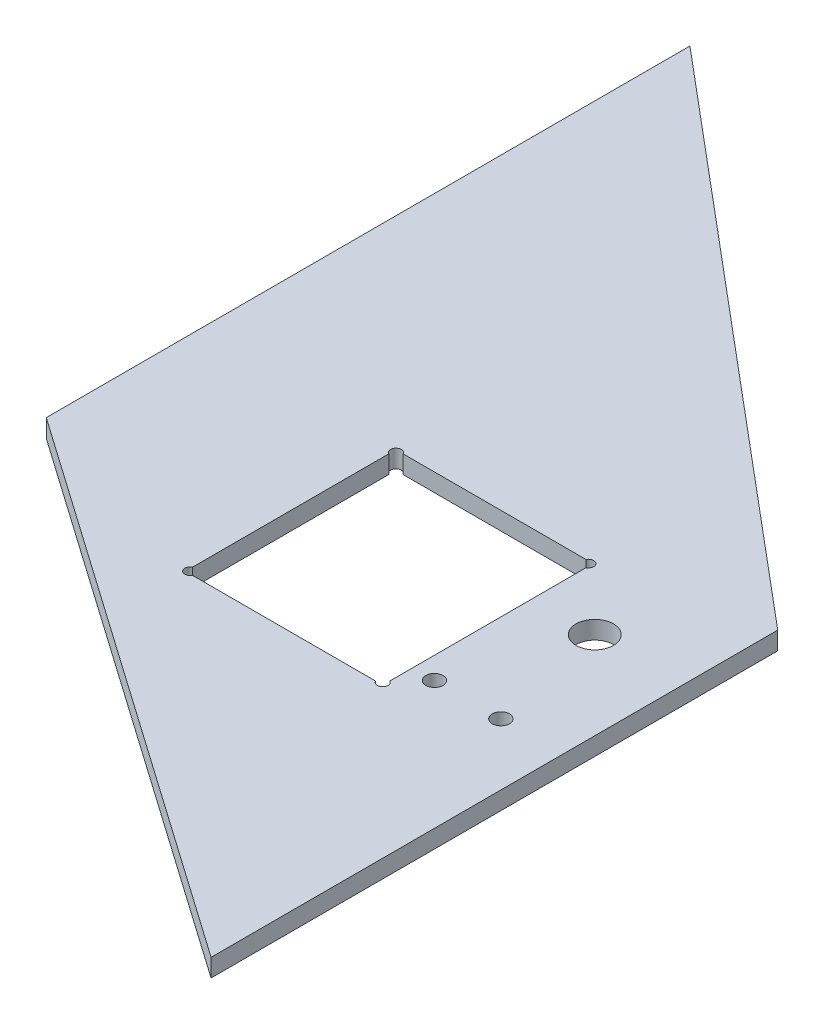
ISO-10303-21;
HEADER;
FILE_DESCRIPTION(('STEP AP214'),'2;1');
FILE_NAME('part.step','',(''),(''),'','','');
FILE_SCHEMA(('AUTOMOTIVE_DESIGN { 1 0 10303 214 1 1 1 1 }'));
ENDSEC;
DATA;
#1=APPLICATION_CONTEXT('core data for automotive mechanical design processes');
#2=APPLICATION_PROTOCOL_DEFINITION('international standard','automotive_design',2000,#1);
#3=PRODUCT_CONTEXT('',#1,'mechanical');
#4=PRODUCT('Part','Part','',(#3));
#5=PRODUCT_RELATED_PRODUCT_CATEGORY('part','',(#4));
#6=PRODUCT_DEFINITION_FORMATION('','',#4);
#7=PRODUCT_DEFINITION_CONTEXT('part definition',#1,'design');
#8=PRODUCT_DEFINITION('design','',#6,#7);
#9=PRODUCT_DEFINITION_SHAPE('','',#8);
#10=(LENGTH_UNIT() NAMED_UNIT(*) SI_UNIT(.MILLI.,.METRE.));
#11=(NAMED_UNIT(*) PLANE_ANGLE_UNIT() SI_UNIT($,.RADIAN.));
#12=(NAMED_UNIT(*) SI_UNIT($,.STERADIAN.) SOLID_ANGLE_UNIT());
#13=UNCERTAINTY_MEASURE_WITH_UNIT(LENGTH_MEASURE(1.E-05),#10,'distance_accuracy_value','');
#14=(GEOMETRIC_REPRESENTATION_CONTEXT(3) GLOBAL_UNCERTAINTY_ASSIGNED_CONTEXT((#13)) GLOBAL_UNIT_ASSIGNED_CONTEXT((#10,
#11,#12)) REPRESENTATION_CONTEXT('',''));
#15=CARTESIAN_POINT('',(0.,0.,0.));
#16=DIRECTION('',(0.,0.,1.));
#17=DIRECTION('',(1.,0.,0.));
#18=AXIS2_PLACEMENT_3D('',#15,#16,#17);
#19=CARTESIAN_POINT('',(0.,-1.27,-9.93045313249222));
#20=DIRECTION('',(0.643306704952837,0.,-0.765608570591215));
#21=DIRECTION('',(0.765608570591215,0.,0.643306704952837));
#22=AXIS2_PLACEMENT_3D('',#19,#20,#21);
#23=PLANE('',#22);
#24=DIRECTION('',(0.,1.,0.));
#25=VECTOR('',#24,1.);
#26=CARTESIAN_POINT('',(116.619290139619,-1.27,88.059530464118));
#27=LINE('',#26,#25);
#28=CARTESIAN_POINT('',(116.619290139619,-1.27,88.059530464118));
#29=VERTEX_POINT('',#28);
#30=CARTESIAN_POINT('',(116.619290139619,2.54,88.059530464118));
#31=VERTEX_POINT('',#30);
#32=EDGE_CURVE('E223',#29,#31,#27,.T.);
#33=ORIENTED_EDGE('',*,*,#32,.F.);
#34=DIRECTION('',(0.765608570591215,0.,0.643306704952837));
#35=VECTOR('',#34,1.);
#36=CARTESIAN_POINT('',(0.,-1.27,-9.93045313249222));
#37=LINE('',#36,#35);
#38=CARTESIAN_POINT('',(0.,-1.27,-9.93045313249222));
#39=VERTEX_POINT('',#38);
#40=EDGE_CURVE('E214',#39,#29,#37,.T.);
#41=ORIENTED_EDGE('',*,*,#40,.F.);
#42=DIRECTION('',(0.,1.,0.));
#43=VECTOR('',#42,1.);
#44=CARTESIAN_POINT('',(0.,-1.27,-9.93045313249222));
#45=LINE('',#44,#43);
#46=CARTESIAN_POINT('',(0.,2.54,-9.93045313249222));
#47=VERTEX_POINT('',#46);
#48=EDGE_CURVE('E224',#39,#47,#45,.T.);
#49=ORIENTED_EDGE('',*,*,#48,.T.);
#50=DIRECTION('',(0.765608570591215,0.,0.643306704952837));
#51=VECTOR('',#50,1.);
#52=CARTESIAN_POINT('',(0.,2.54,-9.93045313249222));
#53=LINE('',#52,#51);
#54=EDGE_CURVE('E195',#47,#31,#53,.T.);
#55=ORIENTED_EDGE('',*,*,#54,.T.);
#56=EDGE_LOOP('',(#33,#41,#49,#55));
#57=FACE_BOUND('',#56,.T.);
#58=ADVANCED_FACE('F37',(#57),#23,.T.);
#59=CARTESIAN_POINT('',(0.,-1.27,-9.93045313249222));
#60=DIRECTION('',(-1.,0.,0.));
#61=DIRECTION('',(0.,0.,-1.));
#62=AXIS2_PLACEMENT_3D('',#59,#60,#61);
#63=PLANE('',#62);
#64=ORIENTED_EDGE('',*,*,#48,.F.);
#65=DIRECTION('',(0.,0.,-1.));
#66=VECTOR('',#65,1.);
#67=CARTESIAN_POINT('',(0.,-1.27,-9.93045313249222));
#68=LINE('',#67,#66);
#69=CARTESIAN_POINT('',(0.,-1.27,126.604027306006));
#70=VERTEX_POINT('',#69);
#71=EDGE_CURVE('E221',#70,#39,#68,.T.);
#72=ORIENTED_EDGE('',*,*,#71,.F.);
#73=DIRECTION('',(0.,1.,0.));
#74=VECTOR('',#73,1.);
#75=CARTESIAN_POINT('',(0.,-1.27,126.604027306006));
#76=LINE('',#75,#74);
#77=CARTESIAN_POINT('',(0.,2.54,126.604027306006));
#78=VERTEX_POINT('',#77);
#79=EDGE_CURVE('E228',#70,#78,#76,.T.);
#80=ORIENTED_EDGE('',*,*,#79,.T.);
#81=DIRECTION('',(0.,0.,-1.));
#82=VECTOR('',#81,1.);
#83=CARTESIAN_POINT('',(0.,2.54,-9.93045313249222));
#84=LINE('',#83,#82);
#85=EDGE_CURVE('E202',#78,#47,#84,.T.);
#86=ORIENTED_EDGE('',*,*,#85,.T.);
#87=EDGE_LOOP('',(#64,#72,#80,#86));
#88=FACE_BOUND('',#87,.T.);
#89=ADVANCED_FACE('F268',(#88),#63,.T.);
#90=CARTESIAN_POINT('',(0.,-1.27,126.604027306006));
#91=DIRECTION('',(-0.573576436351047,0.,0.819152044288991));
#92=DIRECTION('',(-0.819152044288991,0.,-0.573576436351047));
#93=AXIS2_PLACEMENT_3D('',#90,#91,#92);
#94=PLANE('',#93);
#95=ORIENTED_EDGE('',*,*,#79,.F.);
#96=DIRECTION('',(-0.819152044288991,0.,-0.573576436351047));
#97=VECTOR('',#96,1.);
#98=CARTESIAN_POINT('',(0.,-1.27,126.604027306006));
#99=LINE('',#98,#97);
#100=CARTESIAN_POINT('',(116.619290139619,-1.27,208.261733362433));
#101=VERTEX_POINT('',#100);
#102=EDGE_CURVE('E219',#101,#70,#99,.T.);
#103=ORIENTED_EDGE('',*,*,#102,.F.);
#104=DIRECTION('',(0.,1.,0.));
#105=VECTOR('',#104,1.);
#106=CARTESIAN_POINT('',(116.619290139619,-1.27,208.261733362433));
#107=LINE('',#106,#105);
#108=CARTESIAN_POINT('',(116.619290139619,2.54,208.261733362433));
#109=VERTEX_POINT('',#108);
#110=EDGE_CURVE('E231',#101,#109,#107,.T.);
#111=ORIENTED_EDGE('',*,*,#110,.T.);
#112=DIRECTION('',(-0.819152044288991,0.,-0.573576436351047));
#113=VECTOR('',#112,1.);
#114=CARTESIAN_POINT('',(0.,2.54,126.604027306006));
#115=LINE('',#114,#113);
#116=EDGE_CURVE('E200',#109,#78,#115,.T.);
#117=ORIENTED_EDGE('',*,*,#116,.T.);
#118=EDGE_LOOP('',(#95,#103,#111,#117));
#119=FACE_BOUND('',#118,.T.);
#120=ADVANCED_FACE('F273',(#119),#94,.T.);
#121=CARTESIAN_POINT('',(116.619290139619,-1.27,208.261733362433));
#122=DIRECTION('',(1.,0.,0.));
#123=DIRECTION('',(0.,0.,1.));
#124=AXIS2_PLACEMENT_3D('',#121,#122,#123);
#125=PLANE('',#124);
#126=ORIENTED_EDGE('',*,*,#110,.F.);
#127=DIRECTION('',(0.,0.,1.));
#128=VECTOR('',#127,1.);
#129=CARTESIAN_POINT('',(116.619290139619,-1.27,208.261733362433));
#130=LINE('',#129,#128);
#131=EDGE_CURVE('E217',#29,#101,#130,.T.);
#132=ORIENTED_EDGE('',*,*,#131,.F.);
#133=ORIENTED_EDGE('',*,*,#32,.T.);
#134=DIRECTION('',(0.,0.,1.));
#135=VECTOR('',#134,1.);
#136=CARTESIAN_POINT('',(116.619290139619,2.54,208.261733362433));
#137=LINE('',#136,#135);
#138=EDGE_CURVE('E198',#31,#109,#137,.T.);
#139=ORIENTED_EDGE('',*,*,#138,.T.);
#140=EDGE_LOOP('',(#126,#132,#133,#139));
#141=FACE_BOUND('',#140,.T.);
#142=ADVANCED_FACE('F281',(#141),#125,.T.);
#143=CARTESIAN_POINT('',(116.619290139619,-1.27,88.059530464118));
#144=DIRECTION('',(0.,-1.,0.));
#145=DIRECTION('',(0.,0.,1.));
#146=AXIS2_PLACEMENT_3D('',#143,#144,#145);
#147=PLANE('',#146);
#148=CARTESIAN_POINT('',(84.3172932249785,-1.27,95.9237113979477));
#149=DIRECTION('',(0.,-1.,0.));
#150=DIRECTION('',(0.,0.,-1.));
#151=AXIS2_PLACEMENT_3D('',#148,#149,#150);
#152=CIRCLE('',#151,1.1303);
#153=CARTESIAN_POINT('',(83.3075833210953,-1.27,95.4157113979477));
#154=VERTEX_POINT('',#153);
#155=CARTESIAN_POINT('',(84.8252932249785,-1.27,96.933421301831));
#156=VERTEX_POINT('',#155);
#157=EDGE_CURVE('E133',#154,#156,#152,.T.);
#158=ORIENTED_EDGE('',*,*,#157,.F.);
#159=DIRECTION('',(1.,0.,0.));
#160=VECTOR('',#159,1.);
#161=CARTESIAN_POINT('',(42.9822463420664,-1.27,95.4157113979477));
#162=LINE('',#161,#160);
#163=CARTESIAN_POINT('',(44.4999562459497,-1.27,95.4157113979477));
#164=VERTEX_POINT('',#163);
#165=EDGE_CURVE('E178',#164,#154,#162,.T.);
#166=ORIENTED_EDGE('',*,*,#165,.F.);
#167=CARTESIAN_POINT('',(43.4902463420664,-1.27,95.9237113979477));
#168=DIRECTION('',(0.,-1.,0.));
#169=DIRECTION('',(0.,0.,-1.));
#170=AXIS2_PLACEMENT_3D('',#167,#168,#169);
#171=CIRCLE('',#170,1.13029999999999);
#172=CARTESIAN_POINT('',(42.9822463420664,-1.27,96.933421301831));
#173=VERTEX_POINT('',#172);
#174=EDGE_CURVE('E158',#173,#164,#171,.T.);
#175=ORIENTED_EDGE('',*,*,#174,.F.);
#176=DIRECTION('',(0.,0.,-1.));
#177=VECTOR('',#176,1.);
#178=CARTESIAN_POINT('',(42.9822463420664,-1.27,138.798911397948));
#179=LINE('',#178,#177);
#180=CARTESIAN_POINT('',(42.9822463420664,-1.27,138.551201494064));
#181=VERTEX_POINT('',#180);
#182=EDGE_CURVE('E142',#181,#173,#179,.T.);
#183=ORIENTED_EDGE('',*,*,#182,.F.);
#184=CARTESIAN_POINT('',(43.4902463420664,-1.27,139.560911397948));
#185=DIRECTION('',(0.,-1.,0.));
#186=DIRECTION('',(0.,0.,-1.));
#187=AXIS2_PLACEMENT_3D('',#184,#185,#186);
#188=CIRCLE('',#187,1.13029999999999);
#189=CARTESIAN_POINT('',(44.4999562459497,-1.27,140.068911397948));
#190=VERTEX_POINT('',#189);
#191=EDGE_CURVE('E165',#190,#181,#188,.T.);
#192=ORIENTED_EDGE('',*,*,#191,.F.);
#193=DIRECTION('',(-1.,0.,0.));
#194=VECTOR('',#193,1.);
#195=CARTESIAN_POINT('',(42.9822463420664,-1.27,140.068911397948));
#196=LINE('',#195,#194);
#197=CARTESIAN_POINT('',(83.3075833210953,-1.27,140.068911397948));
#198=VERTEX_POINT('',#197);
#199=EDGE_CURVE('E172',#198,#190,#196,.T.);
#200=ORIENTED_EDGE('',*,*,#199,.F.);
#201=CARTESIAN_POINT('',(84.3172932249785,-1.27,139.560911397948));
#202=DIRECTION('',(0.,-1.,0.));
#203=DIRECTION('',(0.,0.,-1.));
#204=AXIS2_PLACEMENT_3D('',#201,#202,#203);
#205=CIRCLE('',#204,1.1303);
#206=CARTESIAN_POINT('',(84.8252932249785,-1.27,138.551201494064));
#207=VERTEX_POINT('',#206);
#208=EDGE_CURVE('E141',#207,#198,#205,.T.);
#209=ORIENTED_EDGE('',*,*,#208,.F.);
#210=DIRECTION('',(0.,0.,1.));
#211=VECTOR('',#210,1.);
#212=CARTESIAN_POINT('',(84.8252932249785,-1.27,138.798911397948));
#213=LINE('',#212,#211);
#214=EDGE_CURVE('E128',#156,#207,#213,.T.);
#215=ORIENTED_EDGE('',*,*,#214,.F.);
#216=EDGE_LOOP('',(#158,#166,#175,#183,#192,#200,#209,#215));
#217=FACE_BOUND('',#216,.T.);
#218=CARTESIAN_POINT('',(103.545290714358,-1.27,133.71692050092));
#219=DIRECTION('',(0.,-1.,0.));
#220=DIRECTION('',(0.,0.,-1.));
#221=AXIS2_PLACEMENT_3D('',#218,#219,#220);
#222=CIRCLE('',#221,1.8288);
#223=CARTESIAN_POINT('',(103.545290714358,-1.27,131.88812050092));
#224=VERTEX_POINT('',#223);
#225=EDGE_CURVE('E204',#224,#224,#222,.T.);
#226=ORIENTED_EDGE('',*,*,#225,.F.);
#227=EDGE_LOOP('',(#226));
#228=FACE_BOUND('',#227,.T.);
#229=CARTESIAN_POINT('',(89.4586071669914,-1.27,133.71692050092));
#230=DIRECTION('',(0.,-1.,0.));
#231=DIRECTION('',(0.,0.,-1.));
#232=AXIS2_PLACEMENT_3D('',#229,#230,#231);
#233=CIRCLE('',#232,1.82880000000002);
#234=CARTESIAN_POINT('',(89.4586071669914,-1.27,131.88812050092));
#235=VERTEX_POINT('',#234);
#236=EDGE_CURVE('E143',#235,#235,#233,.T.);
#237=ORIENTED_EDGE('',*,*,#236,.F.);
#238=EDGE_LOOP('',(#237));
#239=FACE_BOUND('',#238,.T.);
#240=CARTESIAN_POINT('',(98.0423838871812,-1.27,108.29992028092));
#241=DIRECTION('',(0.,-1.,0.));
#242=DIRECTION('',(0.,0.,-1.));
#243=AXIS2_PLACEMENT_3D('',#240,#241,#242);
#244=CIRCLE('',#243,3.96874999999998);
#245=CARTESIAN_POINT('',(98.0423838871812,-1.27,104.33117028092));
#246=VERTEX_POINT('',#245);
#247=EDGE_CURVE('E211',#246,#246,#244,.T.);
#248=ORIENTED_EDGE('',*,*,#247,.F.);
#249=EDGE_LOOP('',(#248));
#250=FACE_BOUND('',#249,.T.);
#251=ORIENTED_EDGE('',*,*,#40,.T.);
#252=ORIENTED_EDGE('',*,*,#131,.T.);
#253=ORIENTED_EDGE('',*,*,#102,.T.);
#254=ORIENTED_EDGE('',*,*,#71,.T.);
#255=EDGE_LOOP('',(#251,#252,#253,#254));
#256=FACE_BOUND('',#255,.T.);
#257=ADVANCED_FACE('F137',(#217,#228,#239,#250,#256),#147,.T.);
#258=CARTESIAN_POINT('',(98.0423838871812,-1.27,108.29992028092));
#259=DIRECTION('',(0.,1.,0.));
#260=DIRECTION('',(0.,0.,-1.));
#261=AXIS2_PLACEMENT_3D('',#258,#259,#260);
#262=CYLINDRICAL_SURFACE('',#261,3.96874999999998);
#263=ORIENTED_EDGE('',*,*,#247,.T.);
#264=EDGE_LOOP('',(#263));
#265=FACE_BOUND('',#264,.T.);
#266=CARTESIAN_POINT('',(98.0423838871812,2.54,108.29992028092));
#267=DIRECTION('',(0.,-1.,0.));
#268=DIRECTION('',(0.,0.,-1.));
#269=AXIS2_PLACEMENT_3D('',#266,#267,#268);
#270=CIRCLE('',#269,3.96874999999998);
#271=CARTESIAN_POINT('',(98.0423838871812,2.54,104.33117028092));
#272=VERTEX_POINT('',#271);
#273=EDGE_CURVE('E192',#272,#272,#270,.T.);
#274=ORIENTED_EDGE('',*,*,#273,.F.);
#275=EDGE_LOOP('',(#274));
#276=FACE_BOUND('',#275,.T.);
#277=ADVANCED_FACE('F299',(#265,#276),#262,.F.);
#278=CARTESIAN_POINT('',(84.8252932249785,-1.27,138.798911397948));
#279=DIRECTION('',(1.,0.,0.));
#280=DIRECTION('',(0.,0.,1.));
#281=AXIS2_PLACEMENT_3D('',#278,#279,#280);
#282=PLANE('',#281);
#283=ORIENTED_EDGE('',*,*,#214,.T.);
#284=DIRECTION('',(0.,1.,0.));
#285=VECTOR('',#284,1.);
#286=CARTESIAN_POINT('',(84.8252932249785,2.54,138.551201494064));
#287=LINE('',#286,#285);
#288=CARTESIAN_POINT('',(84.8252932249785,2.54,138.551201494064));
#289=VERTEX_POINT('',#288);
#290=EDGE_CURVE('E153',#289,#207,#287,.F.);
#291=ORIENTED_EDGE('',*,*,#290,.F.);
#292=DIRECTION('',(0.,0.,1.));
#293=VECTOR('',#292,1.);
#294=CARTESIAN_POINT('',(84.8252932249785,2.54,138.798911397948));
#295=LINE('',#294,#293);
#296=CARTESIAN_POINT('',(84.8252932249785,2.54,96.933421301831));
#297=VERTEX_POINT('',#296);
#298=EDGE_CURVE('E131',#297,#289,#295,.T.);
#299=ORIENTED_EDGE('',*,*,#298,.F.);
#300=DIRECTION('',(0.,1.,0.));
#301=VECTOR('',#300,1.);
#302=CARTESIAN_POINT('',(84.8252932249785,2.54,96.933421301831));
#303=LINE('',#302,#301);
#304=EDGE_CURVE('E124',#156,#297,#303,.T.);
#305=ORIENTED_EDGE('',*,*,#304,.F.);
#306=EDGE_LOOP('',(#283,#291,#299,#305));
#307=FACE_BOUND('',#306,.T.);
#308=ADVANCED_FACE('F126',(#307),#282,.F.);
#309=CARTESIAN_POINT('',(42.9822463420664,-1.27,138.798911397948));
#310=DIRECTION('',(-1.,0.,0.));
#311=DIRECTION('',(0.,0.,-1.));
#312=AXIS2_PLACEMENT_3D('',#309,#310,#311);
#313=PLANE('',#312);
#314=DIRECTION('',(0.,0.,-1.));
#315=VECTOR('',#314,1.);
#316=CARTESIAN_POINT('',(42.9822463420664,2.54,138.798911397948));
#317=LINE('',#316,#315);
#318=CARTESIAN_POINT('',(42.9822463420664,2.54,138.551201494064));
#319=VERTEX_POINT('',#318);
#320=CARTESIAN_POINT('',(42.9822463420664,2.54,96.933421301831));
#321=VERTEX_POINT('',#320);
#322=EDGE_CURVE('E189',#319,#321,#317,.T.);
#323=ORIENTED_EDGE('',*,*,#322,.F.);
#324=DIRECTION('',(0.,1.,0.));
#325=VECTOR('',#324,1.);
#326=CARTESIAN_POINT('',(42.9822463420664,2.54,138.551201494064));
#327=LINE('',#326,#325);
#328=EDGE_CURVE('E168',#181,#319,#327,.T.);
#329=ORIENTED_EDGE('',*,*,#328,.F.);
#330=ORIENTED_EDGE('',*,*,#182,.T.);
#331=DIRECTION('',(0.,1.,0.));
#332=VECTOR('',#331,1.);
#333=CARTESIAN_POINT('',(42.9822463420664,2.54,96.933421301831));
#334=LINE('',#333,#332);
#335=EDGE_CURVE('E161',#321,#173,#334,.F.);
#336=ORIENTED_EDGE('',*,*,#335,.F.);
#337=EDGE_LOOP('',(#323,#329,#330,#336));
#338=FACE_BOUND('',#337,.T.);
#339=ADVANCED_FACE('F251',(#338),#313,.F.);
#340=CARTESIAN_POINT('',(89.4586071669914,-1.27,133.71692050092));
#341=DIRECTION('',(0.,1.,0.));
#342=DIRECTION('',(0.,0.,-1.));
#343=AXIS2_PLACEMENT_3D('',#340,#341,#342);
#344=CYLINDRICAL_SURFACE('',#343,1.82880000000002);
#345=ORIENTED_EDGE('',*,*,#236,.T.);
#346=EDGE_LOOP('',(#345));
#347=FACE_BOUND('',#346,.T.);
#348=CARTESIAN_POINT('',(89.4586071669914,2.54,133.71692050092));
#349=DIRECTION('',(0.,-1.,0.));
#350=DIRECTION('',(0.,0.,-1.));
#351=AXIS2_PLACEMENT_3D('',#348,#349,#350);
#352=CIRCLE('',#351,1.82880000000002);
#353=CARTESIAN_POINT('',(89.4586071669914,2.54,131.88812050092));
#354=VERTEX_POINT('',#353);
#355=EDGE_CURVE('E185',#354,#354,#352,.T.);
#356=ORIENTED_EDGE('',*,*,#355,.F.);
#357=EDGE_LOOP('',(#356));
#358=FACE_BOUND('',#357,.T.);
#359=ADVANCED_FACE('F307',(#347,#358),#344,.F.);
#360=CARTESIAN_POINT('',(103.545290714358,-1.27,133.71692050092));
#361=DIRECTION('',(0.,1.,0.));
#362=DIRECTION('',(0.,0.,-1.));
#363=AXIS2_PLACEMENT_3D('',#360,#361,#362);
#364=CYLINDRICAL_SURFACE('',#363,1.8288);
#365=ORIENTED_EDGE('',*,*,#225,.T.);
#366=EDGE_LOOP('',(#365));
#367=FACE_BOUND('',#366,.T.);
#368=CARTESIAN_POINT('',(103.545290714358,2.54,133.71692050092));
#369=DIRECTION('',(0.,-1.,0.));
#370=DIRECTION('',(0.,0.,-1.));
#371=AXIS2_PLACEMENT_3D('',#368,#369,#370);
#372=CIRCLE('',#371,1.8288);
#373=CARTESIAN_POINT('',(103.545290714358,2.54,131.88812050092));
#374=VERTEX_POINT('',#373);
#375=EDGE_CURVE('E180',#374,#374,#372,.T.);
#376=ORIENTED_EDGE('',*,*,#375,.F.);
#377=EDGE_LOOP('',(#376));
#378=FACE_BOUND('',#377,.T.);
#379=ADVANCED_FACE('F310',(#367,#378),#364,.F.);
#380=CARTESIAN_POINT('',(116.619290139619,2.54,88.059530464118));
#381=DIRECTION('',(0.,-1.,0.));
#382=DIRECTION('',(0.,0.,1.));
#383=AXIS2_PLACEMENT_3D('',#380,#381,#382);
#384=PLANE('',#383);
#385=ORIENTED_EDGE('',*,*,#355,.T.);
#386=EDGE_LOOP('',(#385));
#387=FACE_BOUND('',#386,.T.);
#388=ORIENTED_EDGE('',*,*,#273,.T.);
#389=EDGE_LOOP('',(#388));
#390=FACE_BOUND('',#389,.T.);
#391=ORIENTED_EDGE('',*,*,#54,.F.);
#392=ORIENTED_EDGE('',*,*,#85,.F.);
#393=ORIENTED_EDGE('',*,*,#116,.F.);
#394=ORIENTED_EDGE('',*,*,#138,.F.);
#395=EDGE_LOOP('',(#391,#392,#393,#394));
#396=FACE_BOUND('',#395,.T.);
#397=ORIENTED_EDGE('',*,*,#298,.T.);
#398=CARTESIAN_POINT('',(84.3172932249785,2.54,139.560911397948));
#399=DIRECTION('',(0.,-1.,0.));
#400=DIRECTION('',(0.,0.,-1.));
#401=AXIS2_PLACEMENT_3D('',#398,#399,#400);
#402=CIRCLE('',#401,1.13029999999999);
#403=CARTESIAN_POINT('',(83.3075833210953,2.54,140.068911397948));
#404=VERTEX_POINT('',#403);
#405=EDGE_CURVE('E132',#289,#404,#402,.T.);
#406=ORIENTED_EDGE('',*,*,#405,.T.);
#407=DIRECTION('',(-1.,0.,0.));
#408=VECTOR('',#407,1.);
#409=CARTESIAN_POINT('',(42.9822463420664,2.54,140.068911397948));
#410=LINE('',#409,#408);
#411=CARTESIAN_POINT('',(44.4999562459497,2.54,140.068911397948));
#412=VERTEX_POINT('',#411);
#413=EDGE_CURVE('E171',#404,#412,#410,.T.);
#414=ORIENTED_EDGE('',*,*,#413,.T.);
#415=CARTESIAN_POINT('',(43.4902463420664,2.54,139.560911397948));
#416=DIRECTION('',(0.,-1.,0.));
#417=DIRECTION('',(0.,0.,-1.));
#418=AXIS2_PLACEMENT_3D('',#415,#416,#417);
#419=CIRCLE('',#418,1.13029999999999);
#420=EDGE_CURVE('E163',#412,#319,#419,.T.);
#421=ORIENTED_EDGE('',*,*,#420,.T.);
#422=ORIENTED_EDGE('',*,*,#322,.T.);
#423=CARTESIAN_POINT('',(43.4902463420664,2.54,95.9237113979477));
#424=DIRECTION('',(0.,-1.,0.));
#425=DIRECTION('',(0.,0.,-1.));
#426=AXIS2_PLACEMENT_3D('',#423,#424,#425);
#427=CIRCLE('',#426,1.13029999999999);
#428=CARTESIAN_POINT('',(44.4999562459497,2.54,95.4157113979477));
#429=VERTEX_POINT('',#428);
#430=EDGE_CURVE('E155',#321,#429,#427,.T.);
#431=ORIENTED_EDGE('',*,*,#430,.T.);
#432=DIRECTION('',(1.,0.,0.));
#433=VECTOR('',#432,1.);
#434=CARTESIAN_POINT('',(42.9822463420664,2.54,95.4157113979477));
#435=LINE('',#434,#433);
#436=CARTESIAN_POINT('',(83.3075833210953,2.54,95.4157113979477));
#437=VERTEX_POINT('',#436);
#438=EDGE_CURVE('E175',#429,#437,#435,.T.);
#439=ORIENTED_EDGE('',*,*,#438,.T.);
#440=CARTESIAN_POINT('',(84.3172932249785,2.54,95.9237113979477));
#441=DIRECTION('',(0.,-1.,0.));
#442=DIRECTION('',(0.,0.,-1.));
#443=AXIS2_PLACEMENT_3D('',#440,#441,#442);
#444=CIRCLE('',#443,1.13029999999999);
#445=EDGE_CURVE('E146',#437,#297,#444,.T.);
#446=ORIENTED_EDGE('',*,*,#445,.T.);
#447=EDGE_LOOP('',(#397,#406,#414,#421,#422,#431,#439,#446));
#448=FACE_BOUND('',#447,.T.);
#449=ORIENTED_EDGE('',*,*,#375,.T.);
#450=EDGE_LOOP('',(#449));
#451=FACE_BOUND('',#450,.T.);
#452=ADVANCED_FACE('F246',(#387,#390,#396,#448,#451),#384,.F.);
#453=CARTESIAN_POINT('',(42.9822463420664,-1.27,95.4157113979477));
#454=DIRECTION('',(0.,0.,-1.));
#455=DIRECTION('',(0.,-1.,0.));
#456=AXIS2_PLACEMENT_3D('',#453,#454,#455);
#457=PLANE('',#456);
#458=ORIENTED_EDGE('',*,*,#438,.F.);
#459=DIRECTION('',(0.,1.,0.));
#460=VECTOR('',#459,1.);
#461=CARTESIAN_POINT('',(44.4999562459497,2.54,95.4157113979477));
#462=LINE('',#461,#460);
#463=EDGE_CURVE('E237',#164,#429,#462,.T.);
#464=ORIENTED_EDGE('',*,*,#463,.F.);
#465=ORIENTED_EDGE('',*,*,#165,.T.);
#466=DIRECTION('',(0.,1.,0.));
#467=VECTOR('',#466,1.);
#468=CARTESIAN_POINT('',(83.3075833210953,2.54,95.4157113979477));
#469=LINE('',#468,#467);
#470=EDGE_CURVE('E11',#437,#154,#469,.F.);
#471=ORIENTED_EDGE('',*,*,#470,.F.);
#472=EDGE_LOOP('',(#458,#464,#465,#471));
#473=FACE_BOUND('',#472,.T.);
#474=ADVANCED_FACE('F244',(#473),#457,.F.);
#475=CARTESIAN_POINT('',(42.9822463420664,-1.27,140.068911397948));
#476=DIRECTION('',(0.,0.,1.));
#477=DIRECTION('',(0.,1.,0.));
#478=AXIS2_PLACEMENT_3D('',#475,#476,#477);
#479=PLANE('',#478);
#480=ORIENTED_EDGE('',*,*,#199,.T.);
#481=DIRECTION('',(0.,1.,0.));
#482=VECTOR('',#481,1.);
#483=CARTESIAN_POINT('',(44.4999562459497,2.54,140.068911397948));
#484=LINE('',#483,#482);
#485=EDGE_CURVE('E227',#412,#190,#484,.F.);
#486=ORIENTED_EDGE('',*,*,#485,.F.);
#487=ORIENTED_EDGE('',*,*,#413,.F.);
#488=DIRECTION('',(0.,1.,0.));
#489=VECTOR('',#488,1.);
#490=CARTESIAN_POINT('',(83.3075833210953,2.54,140.068911397948));
#491=LINE('',#490,#489);
#492=EDGE_CURVE('E44',#198,#404,#491,.T.);
#493=ORIENTED_EDGE('',*,*,#492,.F.);
#494=EDGE_LOOP('',(#480,#486,#487,#493));
#495=FACE_BOUND('',#494,.T.);
#496=ADVANCED_FACE('F257',(#495),#479,.F.);
#497=CARTESIAN_POINT('',(43.4902463420664,2.54,139.560911397948));
#498=DIRECTION('',(0.,1.,0.));
#499=DIRECTION('',(0.,0.,-1.));
#500=AXIS2_PLACEMENT_3D('',#497,#498,#499);
#501=CYLINDRICAL_SURFACE('',#500,1.13029999999999);
#502=ORIENTED_EDGE('',*,*,#191,.T.);
#503=ORIENTED_EDGE('',*,*,#328,.T.);
#504=ORIENTED_EDGE('',*,*,#420,.F.);
#505=ORIENTED_EDGE('',*,*,#485,.T.);
#506=EDGE_LOOP('',(#502,#503,#504,#505));
#507=FACE_BOUND('',#506,.T.);
#508=ADVANCED_FACE('F255',(#507),#501,.F.);
#509=CARTESIAN_POINT('',(43.4902463420664,2.54,95.9237113979477));
#510=DIRECTION('',(0.,1.,0.));
#511=DIRECTION('',(0.,0.,-1.));
#512=AXIS2_PLACEMENT_3D('',#509,#510,#511);
#513=CYLINDRICAL_SURFACE('',#512,1.13029999999999);
#514=ORIENTED_EDGE('',*,*,#430,.F.);
#515=ORIENTED_EDGE('',*,*,#335,.T.);
#516=ORIENTED_EDGE('',*,*,#174,.T.);
#517=ORIENTED_EDGE('',*,*,#463,.T.);
#518=EDGE_LOOP('',(#514,#515,#516,#517));
#519=FACE_BOUND('',#518,.T.);
#520=ADVANCED_FACE('F240',(#519),#513,.F.);
#521=CARTESIAN_POINT('',(84.3172932249785,2.54,139.560911397948));
#522=DIRECTION('',(0.,1.,0.));
#523=DIRECTION('',(0.,0.,-1.));
#524=AXIS2_PLACEMENT_3D('',#521,#522,#523);
#525=CYLINDRICAL_SURFACE('',#524,1.13029999999999);
#526=ORIENTED_EDGE('',*,*,#405,.F.);
#527=ORIENTED_EDGE('',*,*,#290,.T.);
#528=ORIENTED_EDGE('',*,*,#208,.T.);
#529=ORIENTED_EDGE('',*,*,#492,.T.);
#530=EDGE_LOOP('',(#526,#527,#528,#529));
#531=FACE_BOUND('',#530,.T.);
#532=ADVANCED_FACE('F258',(#531),#525,.F.);
#533=CARTESIAN_POINT('',(84.3172932249785,2.54,95.9237113979477));
#534=DIRECTION('',(0.,1.,0.));
#535=DIRECTION('',(0.,0.,-1.));
#536=AXIS2_PLACEMENT_3D('',#533,#534,#535);
#537=CYLINDRICAL_SURFACE('',#536,1.13029999999999);
#538=ORIENTED_EDGE('',*,*,#157,.T.);
#539=ORIENTED_EDGE('',*,*,#304,.T.);
#540=ORIENTED_EDGE('',*,*,#445,.F.);
#541=ORIENTED_EDGE('',*,*,#470,.T.);
#542=EDGE_LOOP('',(#538,#539,#540,#541));
#543=FACE_BOUND('',#542,.T.);
#544=ADVANCED_FACE('F145',(#543),#537,.F.);
#545=CLOSED_SHELL('',(#58,#89,#120,#142,#257,#277,#308,#339,#359,#379,#452,#474,#496,#508,#520,
#532,#544));
#546=MANIFOLD_SOLID_BREP('B2',#545);
#547=ADVANCED_BREP_SHAPE_REPRESENTATION('',(#18,#546),#14);
#548=SHAPE_DEFINITION_REPRESENTATION(#9,#547);
ENDSEC;
END-ISO-10303-21;
